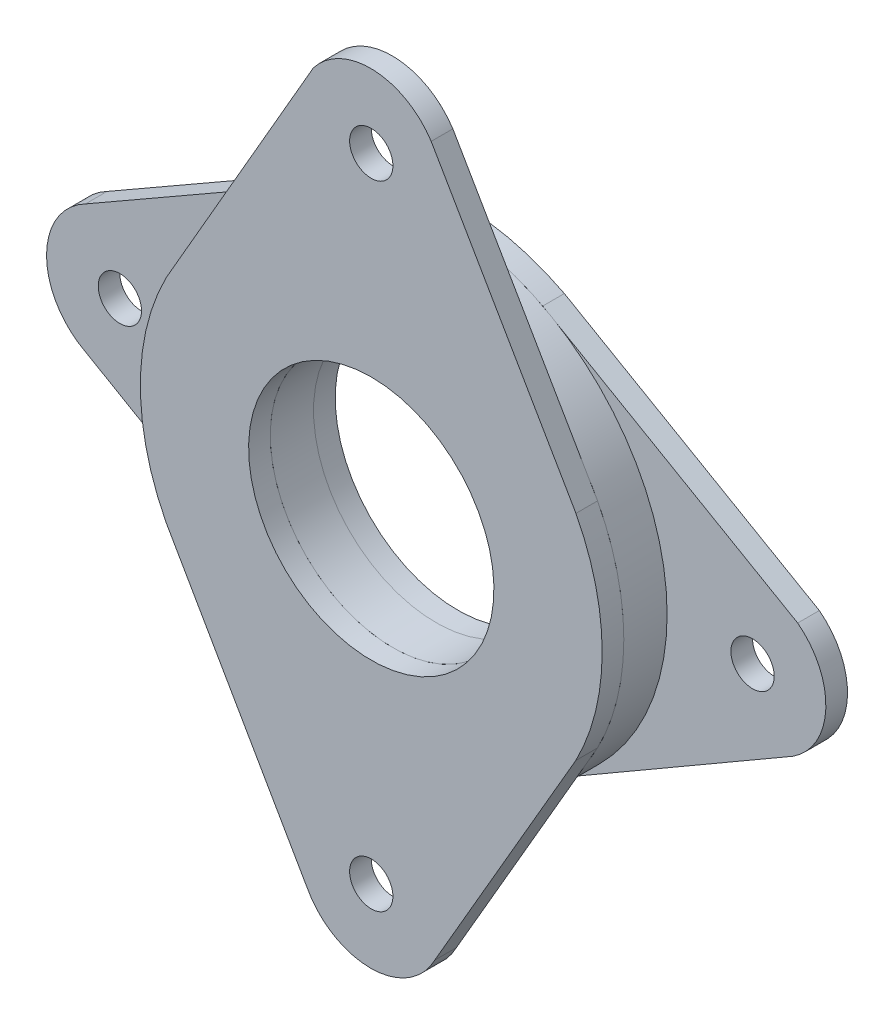
ISO-10303-21;
HEADER;
FILE_DESCRIPTION(('STEP AP214'),'2;1');
FILE_NAME('part.step','',(''),(''),'','','');
FILE_SCHEMA(('AUTOMOTIVE_DESIGN { 1 0 10303 214 1 1 1 1 }'));
ENDSEC;
DATA;
#1=APPLICATION_CONTEXT('core data for automotive mechanical design processes');
#2=APPLICATION_PROTOCOL_DEFINITION('international standard','automotive_design',2000,#1);
#3=PRODUCT_CONTEXT('',#1,'mechanical');
#4=PRODUCT('Part','Part','',(#3));
#5=PRODUCT_RELATED_PRODUCT_CATEGORY('part','',(#4));
#6=PRODUCT_DEFINITION_FORMATION('','',#4);
#7=PRODUCT_DEFINITION_CONTEXT('part definition',#1,'design');
#8=PRODUCT_DEFINITION('design','',#6,#7);
#9=PRODUCT_DEFINITION_SHAPE('','',#8);
#10=(LENGTH_UNIT() NAMED_UNIT(*) SI_UNIT(.MILLI.,.METRE.));
#11=(NAMED_UNIT(*) PLANE_ANGLE_UNIT() SI_UNIT($,.RADIAN.));
#12=(NAMED_UNIT(*) SI_UNIT($,.STERADIAN.) SOLID_ANGLE_UNIT());
#13=UNCERTAINTY_MEASURE_WITH_UNIT(LENGTH_MEASURE(1.E-05),#10,'distance_accuracy_value','');
#14=(GEOMETRIC_REPRESENTATION_CONTEXT(3) GLOBAL_UNCERTAINTY_ASSIGNED_CONTEXT((#13)) GLOBAL_UNIT_ASSIGNED_CONTEXT((#10,
#11,#12)) REPRESENTATION_CONTEXT('',''));
#15=CARTESIAN_POINT('',(0.,0.,0.));
#16=DIRECTION('',(0.,0.,1.));
#17=DIRECTION('',(1.,0.,0.));
#18=AXIS2_PLACEMENT_3D('',#15,#16,#17);
#19=CARTESIAN_POINT('',(0.,0.,1.5));
#20=DIRECTION('',(0.,0.,1.));
#21=DIRECTION('',(1.,0.,0.));
#22=AXIS2_PLACEMENT_3D('',#19,#20,#21);
#23=CYLINDRICAL_SURFACE('',#22,16.);
#24=CARTESIAN_POINT('',(0.,0.,1.5));
#25=DIRECTION('',(0.,0.,1.));
#26=DIRECTION('',(1.,0.,0.));
#27=AXIS2_PLACEMENT_3D('',#24,#25,#26);
#28=CIRCLE('',#27,16.);
#29=CARTESIAN_POINT('',(16.,0.,1.5));
#30=VERTEX_POINT('',#29);
#31=EDGE_CURVE('E11',#30,#30,#28,.T.);
#32=ORIENTED_EDGE('',*,*,#31,.T.);
#33=EDGE_LOOP('',(#32));
#34=FACE_BOUND('',#33,.T.);
#35=CARTESIAN_POINT('',(0.,0.,4.5));
#36=DIRECTION('',(0.,0.,1.));
#37=DIRECTION('',(1.,0.,0.));
#38=AXIS2_PLACEMENT_3D('',#35,#36,#37);
#39=CIRCLE('',#38,16.);
#40=CARTESIAN_POINT('',(16.,0.,4.5));
#41=VERTEX_POINT('',#40);
#42=EDGE_CURVE('E60',#41,#41,#39,.T.);
#43=ORIENTED_EDGE('',*,*,#42,.F.);
#44=EDGE_LOOP('',(#43));
#45=FACE_BOUND('',#44,.T.);
#46=ADVANCED_FACE('F50',(#34,#45),#23,.T.);
#47=CARTESIAN_POINT('',(0.,0.,1.5));
#48=DIRECTION('',(0.,0.,1.));
#49=DIRECTION('',(1.,0.,0.));
#50=AXIS2_PLACEMENT_3D('',#47,#48,#49);
#51=PLANE('',#50);
#52=CARTESIAN_POINT('',(0.,0.,1.5));
#53=DIRECTION('',(0.,0.,1.));
#54=DIRECTION('',(1.,0.,0.));
#55=AXIS2_PLACEMENT_3D('',#52,#53,#54);
#56=CIRCLE('',#55,8.5);
#57=CARTESIAN_POINT('',(8.5,0.,1.5));
#58=VERTEX_POINT('',#57);
#59=EDGE_CURVE('E56',#58,#58,#56,.T.);
#60=ORIENTED_EDGE('',*,*,#59,.T.);
#61=EDGE_LOOP('',(#60));
#62=FACE_BOUND('',#61,.T.);
#63=ORIENTED_EDGE('',*,*,#31,.F.);
#64=EDGE_LOOP('',(#63));
#65=FACE_BOUND('',#64,.T.);
#66=ADVANCED_FACE('F79',(#62,#65),#51,.F.);
#67=CARTESIAN_POINT('',(0.,0.,1.5));
#68=DIRECTION('',(0.,0.,1.));
#69=DIRECTION('',(1.,0.,0.));
#70=AXIS2_PLACEMENT_3D('',#67,#68,#69);
#71=CYLINDRICAL_SURFACE('',#70,8.5);
#72=ORIENTED_EDGE('',*,*,#59,.F.);
#73=EDGE_LOOP('',(#72));
#74=FACE_BOUND('',#73,.T.);
#75=CARTESIAN_POINT('',(0.,0.,4.5));
#76=DIRECTION('',(0.,0.,1.));
#77=DIRECTION('',(1.,0.,0.));
#78=AXIS2_PLACEMENT_3D('',#75,#76,#77);
#79=CIRCLE('',#78,8.5);
#80=CARTESIAN_POINT('',(8.5,0.,4.5));
#81=VERTEX_POINT('',#80);
#82=EDGE_CURVE('E64',#81,#81,#79,.T.);
#83=ORIENTED_EDGE('',*,*,#82,.T.);
#84=EDGE_LOOP('',(#83));
#85=FACE_BOUND('',#84,.T.);
#86=ADVANCED_FACE('F70',(#74,#85),#71,.F.);
#87=CARTESIAN_POINT('',(0.,0.,4.5));
#88=DIRECTION('',(0.,0.,1.));
#89=DIRECTION('',(1.,0.,0.));
#90=AXIS2_PLACEMENT_3D('',#87,#88,#89);
#91=PLANE('',#90);
#92=ORIENTED_EDGE('',*,*,#42,.T.);
#93=EDGE_LOOP('',(#92));
#94=FACE_BOUND('',#93,.T.);
#95=ORIENTED_EDGE('',*,*,#82,.F.);
#96=EDGE_LOOP('',(#95));
#97=FACE_BOUND('',#96,.T.);
#98=ADVANCED_FACE('F72',(#94,#97),#91,.T.);
#99=CLOSED_SHELL('',(#46,#66,#86,#98));
#100=MANIFOLD_SOLID_BREP('B2',#99);
#101=CARTESIAN_POINT('',(0.,0.,4.5));
#102=DIRECTION('',(0.,0.,1.));
#103=DIRECTION('',(0.,-1.,0.));
#104=AXIS2_PLACEMENT_3D('',#101,#102,#103);
#105=CYLINDRICAL_SURFACE('',#104,16.);
#106=CARTESIAN_POINT('',(0.,0.,6.));
#107=DIRECTION('',(0.,0.,1.));
#108=DIRECTION('',(0.,1.,0.));
#109=AXIS2_PLACEMENT_3D('',#106,#107,#108);
#110=CIRCLE('',#109,16.);
#111=CARTESIAN_POINT('',(-14.1966447321718,7.37938197605322,6.));
#112=VERTEX_POINT('',#111);
#113=CARTESIAN_POINT('',(-14.2247700532383,-7.32501992710561,6.));
#114=VERTEX_POINT('',#113);
#115=EDGE_CURVE('E218',#112,#114,#110,.T.);
#116=ORIENTED_EDGE('',*,*,#115,.F.);
#117=DIRECTION('',(0.,0.,1.));
#118=VECTOR('',#117,1.);
#119=CARTESIAN_POINT('',(-14.1966447321718,7.37938197605322,4.5));
#120=LINE('',#119,#118);
#121=CARTESIAN_POINT('',(-14.1966447321718,7.37938197605322,4.5));
#122=VERTEX_POINT('',#121);
#123=EDGE_CURVE('E217',#122,#112,#120,.T.);
#124=ORIENTED_EDGE('',*,*,#123,.F.);
#125=CARTESIAN_POINT('',(0.,0.,4.5));
#126=DIRECTION('',(0.,0.,1.));
#127=DIRECTION('',(0.,1.,0.));
#128=AXIS2_PLACEMENT_3D('',#125,#126,#127);
#129=CIRCLE('',#128,16.);
#130=CARTESIAN_POINT('',(-14.2247700532383,-7.32501992710561,4.5));
#131=VERTEX_POINT('',#130);
#132=EDGE_CURVE('E237',#122,#131,#129,.T.);
#133=ORIENTED_EDGE('',*,*,#132,.T.);
#134=DIRECTION('',(0.,0.,1.));
#135=VECTOR('',#134,1.);
#136=CARTESIAN_POINT('',(-14.2247700532383,-7.32501992710561,4.5));
#137=LINE('',#136,#135);
#138=EDGE_CURVE('E48',#131,#114,#137,.T.);
#139=ORIENTED_EDGE('',*,*,#138,.T.);
#140=EDGE_LOOP('',(#116,#124,#133,#139));
#141=FACE_BOUND('',#140,.T.);
#142=ADVANCED_FACE('F122',(#141),#105,.T.);
#143=CARTESIAN_POINT('',(-4.479321595876,-24.3098461907375,4.5));
#144=DIRECTION('',(0.867365526638176,0.497671621854892,0.));
#145=DIRECTION('',(-0.497671621854892,0.867365526638176,0.));
#146=AXIS2_PLACEMENT_3D('',#143,#144,#145);
#147=PLANE('',#146);
#148=DIRECTION('',(0.497671621854892,-0.867365526638176,0.));
#149=VECTOR('',#148,1.);
#150=CARTESIAN_POINT('',(-4.479321595876,-24.3098461907375,6.));
#151=LINE('',#150,#149);
#152=CARTESIAN_POINT('',(-4.479321595876,-24.3098461907375,6.));
#153=VERTEX_POINT('',#152);
#154=EDGE_CURVE('E220',#114,#153,#151,.T.);
#155=ORIENTED_EDGE('',*,*,#154,.F.);
#156=ORIENTED_EDGE('',*,*,#138,.F.);
#157=DIRECTION('',(0.497671621854892,-0.867365526638176,0.));
#158=VECTOR('',#157,1.);
#159=CARTESIAN_POINT('',(-4.479321595876,-24.3098461907375,4.5));
#160=LINE('',#159,#158);
#161=CARTESIAN_POINT('',(-4.479321595876,-24.3098461907375,4.5));
#162=VERTEX_POINT('',#161);
#163=EDGE_CURVE('E176',#131,#162,#160,.T.);
#164=ORIENTED_EDGE('',*,*,#163,.T.);
#165=DIRECTION('',(0.,0.,1.));
#166=VECTOR('',#165,1.);
#167=CARTESIAN_POINT('',(-4.479321595876,-24.3098461907375,4.5));
#168=LINE('',#167,#166);
#169=EDGE_CURVE('E130',#162,#153,#168,.T.);
#170=ORIENTED_EDGE('',*,*,#169,.T.);
#171=EDGE_LOOP('',(#155,#156,#164,#170));
#172=FACE_BOUND('',#171,.T.);
#173=ADVANCED_FACE('F249',(#172),#147,.F.);
#174=CARTESIAN_POINT('',(-0.0448656845738966,-21.9999542515512,4.5));
#175=DIRECTION('',(0.,0.,1.));
#176=DIRECTION('',(0.,-1.,0.));
#177=AXIS2_PLACEMENT_3D('',#174,#175,#176);
#178=CYLINDRICAL_SURFACE('',#177,5.);
#179=CARTESIAN_POINT('',(-0.0448656845738966,-21.9999542515512,6.));
#180=DIRECTION('',(0.,0.,1.));
#181=DIRECTION('',(0.,1.,0.));
#182=AXIS2_PLACEMENT_3D('',#179,#180,#181);
#183=CIRCLE('',#182,5.);
#184=CARTESIAN_POINT('',(4.39320110895157,-24.3029008719067,6.));
#185=VERTEX_POINT('',#184);
#186=EDGE_CURVE('E224',#153,#185,#183,.T.);
#187=ORIENTED_EDGE('',*,*,#186,.F.);
#188=ORIENTED_EDGE('',*,*,#169,.F.);
#189=CARTESIAN_POINT('',(-0.0448656845738966,-21.9999542515512,4.5));
#190=DIRECTION('',(0.,0.,1.));
#191=DIRECTION('',(0.,1.,0.));
#192=AXIS2_PLACEMENT_3D('',#189,#190,#191);
#193=CIRCLE('',#192,5.);
#194=CARTESIAN_POINT('',(4.39320110895157,-24.3029008719067,4.5));
#195=VERTEX_POINT('',#194);
#196=EDGE_CURVE('E258',#162,#195,#193,.T.);
#197=ORIENTED_EDGE('',*,*,#196,.T.);
#198=DIRECTION('',(0.,0.,1.));
#199=VECTOR('',#198,1.);
#200=CARTESIAN_POINT('',(4.39320110895157,-24.3029008719067,4.5));
#201=LINE('',#200,#199);
#202=EDGE_CURVE('E244',#195,#185,#201,.T.);
#203=ORIENTED_EDGE('',*,*,#202,.T.);
#204=EDGE_LOOP('',(#187,#188,#197,#203));
#205=FACE_BOUND('',#204,.T.);
#206=ADVANCED_FACE('F271',(#205),#178,.T.);
#207=CARTESIAN_POINT('',(4.39320110895158,-24.3029008719067,4.5));
#208=DIRECTION('',(-0.86524131954194,0.501355621248353,0.));
#209=DIRECTION('',(-0.501355621248353,-0.86524131954194,0.));
#210=AXIS2_PLACEMENT_3D('',#207,#208,#209);
#211=PLANE('',#210);
#212=DIRECTION('',(0.501355621248353,0.86524131954194,0.));
#213=VECTOR('',#212,1.);
#214=CARTESIAN_POINT('',(4.39320110895158,-24.3029008719067,6.));
#215=LINE('',#214,#213);
#216=CARTESIAN_POINT('',(14.1719290272993,-7.4267373486069,6.));
#217=VERTEX_POINT('',#216);
#218=EDGE_CURVE('E227',#185,#217,#215,.T.);
#219=ORIENTED_EDGE('',*,*,#218,.F.);
#220=ORIENTED_EDGE('',*,*,#202,.F.);
#221=DIRECTION('',(0.501355621248353,0.86524131954194,0.));
#222=VECTOR('',#221,1.);
#223=CARTESIAN_POINT('',(4.39320110895158,-24.3029008719067,4.5));
#224=LINE('',#223,#222);
#225=CARTESIAN_POINT('',(14.1719290272993,-7.4267373486069,4.5));
#226=VERTEX_POINT('',#225);
#227=EDGE_CURVE('E212',#195,#226,#224,.T.);
#228=ORIENTED_EDGE('',*,*,#227,.T.);
#229=DIRECTION('',(0.,0.,1.));
#230=VECTOR('',#229,1.);
#231=CARTESIAN_POINT('',(14.1719290272993,-7.4267373486069,4.5));
#232=LINE('',#231,#230);
#233=EDGE_CURVE('E241',#226,#217,#232,.T.);
#234=ORIENTED_EDGE('',*,*,#233,.T.);
#235=EDGE_LOOP('',(#219,#220,#228,#234));
#236=FACE_BOUND('',#235,.T.);
#237=ADVANCED_FACE('F267',(#236),#211,.F.);
#238=CARTESIAN_POINT('',(0.,0.,4.5));
#239=DIRECTION('',(0.,0.,1.));
#240=DIRECTION('',(0.,-1.,0.));
#241=AXIS2_PLACEMENT_3D('',#238,#239,#240);
#242=CYLINDRICAL_SURFACE('',#241,16.);
#243=CARTESIAN_POINT('',(0.,0.,6.));
#244=DIRECTION('',(0.,0.,1.));
#245=DIRECTION('',(0.,1.,0.));
#246=AXIS2_PLACEMENT_3D('',#243,#244,#245);
#247=CIRCLE('',#246,16.);
#248=CARTESIAN_POINT('',(14.1817399706489,7.40798565096466,6.));
#249=VERTEX_POINT('',#248);
#250=EDGE_CURVE('E230',#217,#249,#247,.T.);
#251=ORIENTED_EDGE('',*,*,#250,.F.);
#252=ORIENTED_EDGE('',*,*,#233,.F.);
#253=CARTESIAN_POINT('',(0.,0.,4.5));
#254=DIRECTION('',(0.,0.,1.));
#255=DIRECTION('',(0.,1.,0.));
#256=AXIS2_PLACEMENT_3D('',#253,#254,#255);
#257=CIRCLE('',#256,16.);
#258=CARTESIAN_POINT('',(14.1817399706489,7.40798565096466,4.5));
#259=VERTEX_POINT('',#258);
#260=EDGE_CURVE('E210',#226,#259,#257,.T.);
#261=ORIENTED_EDGE('',*,*,#260,.T.);
#262=DIRECTION('',(0.,0.,1.));
#263=VECTOR('',#262,1.);
#264=CARTESIAN_POINT('',(14.1817399706489,7.40798565096466,4.5));
#265=LINE('',#264,#263);
#266=EDGE_CURVE('E204',#259,#249,#265,.T.);
#267=ORIENTED_EDGE('',*,*,#266,.T.);
#268=EDGE_LOOP('',(#251,#252,#261,#267));
#269=FACE_BOUND('',#268,.T.);
#270=ADVANCED_FACE('F270',(#269),#242,.T.);
#271=CARTESIAN_POINT('',(14.1817399706489,7.40798565096467,4.5));
#272=DIRECTION('',(-0.865247361344809,-0.501345194138575,0.));
#273=DIRECTION('',(0.501345194138575,-0.865247361344809,0.));
#274=AXIS2_PLACEMENT_3D('',#271,#272,#273);
#275=PLANE('',#274);
#276=DIRECTION('',(-0.501345194138575,0.865247361344809,0.));
#277=VECTOR('',#276,1.);
#278=CARTESIAN_POINT('',(14.1817399706489,7.40798565096467,6.));
#279=LINE('',#278,#277);
#280=CARTESIAN_POINT('',(4.15252442844814,24.7169224587822,6.));
#281=VERTEX_POINT('',#280);
#282=EDGE_CURVE('E233',#249,#281,#279,.T.);
#283=ORIENTED_EDGE('',*,*,#282,.F.);
#284=ORIENTED_EDGE('',*,*,#266,.F.);
#285=DIRECTION('',(-0.501345194138575,0.865247361344809,0.));
#286=VECTOR('',#285,1.);
#287=CARTESIAN_POINT('',(14.1817399706489,7.40798565096467,4.5));
#288=LINE('',#287,#286);
#289=CARTESIAN_POINT('',(4.15252442844814,24.7169224587822,4.5));
#290=VERTEX_POINT('',#289);
#291=EDGE_CURVE('E194',#259,#290,#288,.T.);
#292=ORIENTED_EDGE('',*,*,#291,.T.);
#293=DIRECTION('',(0.,0.,1.));
#294=VECTOR('',#293,1.);
#295=CARTESIAN_POINT('',(4.15252442844814,24.7169224587822,4.5));
#296=LINE('',#295,#294);
#297=EDGE_CURVE('E199',#290,#281,#296,.T.);
#298=ORIENTED_EDGE('',*,*,#297,.T.);
#299=EDGE_LOOP('',(#283,#284,#292,#298));
#300=FACE_BOUND('',#299,.T.);
#301=ADVANCED_FACE('F207',(#300),#275,.F.);
#302=CARTESIAN_POINT('',(-0.0448656845740502,21.9999542515512,4.5));
#303=DIRECTION('',(0.,0.,1.));
#304=DIRECTION('',(0.,-1.,0.));
#305=AXIS2_PLACEMENT_3D('',#302,#303,#304);
#306=CYLINDRICAL_SURFACE('',#305,5.);
#307=CARTESIAN_POINT('',(-0.0448656845740502,21.9999542515512,6.));
#308=DIRECTION('',(0.,0.,1.));
#309=DIRECTION('',(0.,1.,0.));
#310=AXIS2_PLACEMENT_3D('',#307,#308,#309);
#311=CIRCLE('',#310,5.);
#312=CARTESIAN_POINT('',(-4.00944343188171,25.0466119752795,6.));
#313=VERTEX_POINT('',#312);
#314=EDGE_CURVE('E201',#281,#313,#311,.T.);
#315=ORIENTED_EDGE('',*,*,#314,.F.);
#316=ORIENTED_EDGE('',*,*,#297,.F.);
#317=CARTESIAN_POINT('',(-0.0448656845740502,21.9999542515512,4.5));
#318=DIRECTION('',(0.,0.,1.));
#319=DIRECTION('',(0.,1.,0.));
#320=AXIS2_PLACEMENT_3D('',#317,#318,#319);
#321=CIRCLE('',#320,5.);
#322=CARTESIAN_POINT('',(-4.00944343188171,25.0466119752795,4.5));
#323=VERTEX_POINT('',#322);
#324=EDGE_CURVE('E190',#290,#323,#321,.T.);
#325=ORIENTED_EDGE('',*,*,#324,.T.);
#326=DIRECTION('',(0.,0.,1.));
#327=VECTOR('',#326,1.);
#328=CARTESIAN_POINT('',(-4.00944343188171,25.0466119752795,4.5));
#329=LINE('',#328,#327);
#330=EDGE_CURVE('E205',#323,#313,#329,.T.);
#331=ORIENTED_EDGE('',*,*,#330,.T.);
#332=EDGE_LOOP('',(#315,#316,#325,#331));
#333=FACE_BOUND('',#332,.T.);
#334=ADVANCED_FACE('F200',(#333),#306,.T.);
#335=CARTESIAN_POINT('',(-14.1966447321718,7.37938197605322,4.5));
#336=DIRECTION('',(0.866300842267318,-0.499522622797943,0.));
#337=DIRECTION('',(0.499522622797943,0.866300842267318,0.));
#338=AXIS2_PLACEMENT_3D('',#335,#336,#337);
#339=PLANE('',#338);
#340=DIRECTION('',(-0.499522622797943,-0.866300842267318,0.));
#341=VECTOR('',#340,1.);
#342=CARTESIAN_POINT('',(-14.1966447321718,7.37938197605322,6.));
#343=LINE('',#342,#341);
#344=EDGE_CURVE('E164',#313,#112,#343,.T.);
#345=ORIENTED_EDGE('',*,*,#344,.F.);
#346=ORIENTED_EDGE('',*,*,#330,.F.);
#347=DIRECTION('',(-0.499522622797943,-0.866300842267318,0.));
#348=VECTOR('',#347,1.);
#349=CARTESIAN_POINT('',(-14.1966447321718,7.37938197605322,4.5));
#350=LINE('',#349,#348);
#351=EDGE_CURVE('E138',#323,#122,#350,.T.);
#352=ORIENTED_EDGE('',*,*,#351,.T.);
#353=ORIENTED_EDGE('',*,*,#123,.T.);
#354=EDGE_LOOP('',(#345,#346,#352,#353));
#355=FACE_BOUND('',#354,.T.);
#356=ADVANCED_FACE('F303',(#355),#339,.F.);
#357=CARTESIAN_POINT('',(0.,0.,4.5));
#358=DIRECTION('',(0.,0.,-1.));
#359=DIRECTION('',(0.,1.,0.));
#360=AXIS2_PLACEMENT_3D('',#357,#358,#359);
#361=PLANE('',#360);
#362=CARTESIAN_POINT('',(0.,-21.92,4.5));
#363=DIRECTION('',(0.,0.,1.));
#364=DIRECTION('',(0.,1.,0.));
#365=AXIS2_PLACEMENT_3D('',#362,#363,#364);
#366=CIRCLE('',#365,1.5);
#367=CARTESIAN_POINT('',(0.,-20.42,4.5));
#368=VERTEX_POINT('',#367);
#369=EDGE_CURVE('E364',#368,#368,#366,.T.);
#370=ORIENTED_EDGE('',*,*,#369,.T.);
#371=EDGE_LOOP('',(#370));
#372=FACE_BOUND('',#371,.T.);
#373=CARTESIAN_POINT('',(0.,21.92,4.5));
#374=DIRECTION('',(0.,0.,1.));
#375=DIRECTION('',(0.,1.,0.));
#376=AXIS2_PLACEMENT_3D('',#373,#374,#375);
#377=CIRCLE('',#376,1.5);
#378=CARTESIAN_POINT('',(0.,23.42,4.5));
#379=VERTEX_POINT('',#378);
#380=EDGE_CURVE('E369',#379,#379,#377,.T.);
#381=ORIENTED_EDGE('',*,*,#380,.T.);
#382=EDGE_LOOP('',(#381));
#383=FACE_BOUND('',#382,.T.);
#384=CARTESIAN_POINT('',(0.,0.,4.5));
#385=DIRECTION('',(0.,0.,1.));
#386=DIRECTION('',(0.,1.,0.));
#387=AXIS2_PLACEMENT_3D('',#384,#385,#386);
#388=CIRCLE('',#387,8.5);
#389=CARTESIAN_POINT('',(0.,8.5,4.5));
#390=VERTEX_POINT('',#389);
#391=EDGE_CURVE('E261',#390,#390,#388,.T.);
#392=ORIENTED_EDGE('',*,*,#391,.T.);
#393=EDGE_LOOP('',(#392));
#394=FACE_BOUND('',#393,.T.);
#395=ORIENTED_EDGE('',*,*,#132,.F.);
#396=ORIENTED_EDGE('',*,*,#351,.F.);
#397=ORIENTED_EDGE('',*,*,#324,.F.);
#398=ORIENTED_EDGE('',*,*,#291,.F.);
#399=ORIENTED_EDGE('',*,*,#260,.F.);
#400=ORIENTED_EDGE('',*,*,#227,.F.);
#401=ORIENTED_EDGE('',*,*,#196,.F.);
#402=ORIENTED_EDGE('',*,*,#163,.F.);
#403=EDGE_LOOP('',(#395,#396,#397,#398,#399,#400,#401,#402));
#404=FACE_BOUND('',#403,.T.);
#405=ADVANCED_FACE('F192',(#372,#383,#394,#404),#361,.T.);
#406=CARTESIAN_POINT('',(0.,0.,6.));
#407=DIRECTION('',(0.,0.,-1.));
#408=DIRECTION('',(0.,1.,0.));
#409=AXIS2_PLACEMENT_3D('',#406,#407,#408);
#410=PLANE('',#409);
#411=CARTESIAN_POINT('',(0.,-21.92,6.));
#412=DIRECTION('',(0.,0.,1.));
#413=DIRECTION('',(0.,1.,0.));
#414=AXIS2_PLACEMENT_3D('',#411,#412,#413);
#415=CIRCLE('',#414,1.5);
#416=CARTESIAN_POINT('',(0.,-20.42,6.));
#417=VERTEX_POINT('',#416);
#418=EDGE_CURVE('E221',#417,#417,#415,.T.);
#419=ORIENTED_EDGE('',*,*,#418,.F.);
#420=EDGE_LOOP('',(#419));
#421=FACE_BOUND('',#420,.T.);
#422=CARTESIAN_POINT('',(0.,21.92,6.));
#423=DIRECTION('',(0.,0.,1.));
#424=DIRECTION('',(0.,1.,0.));
#425=AXIS2_PLACEMENT_3D('',#422,#423,#424);
#426=CIRCLE('',#425,1.5);
#427=CARTESIAN_POINT('',(0.,23.42,6.));
#428=VERTEX_POINT('',#427);
#429=EDGE_CURVE('E365',#428,#428,#426,.T.);
#430=ORIENTED_EDGE('',*,*,#429,.F.);
#431=EDGE_LOOP('',(#430));
#432=FACE_BOUND('',#431,.T.);
#433=CARTESIAN_POINT('',(0.,0.,6.));
#434=DIRECTION('',(0.,0.,1.));
#435=DIRECTION('',(0.,1.,0.));
#436=AXIS2_PLACEMENT_3D('',#433,#434,#435);
#437=CIRCLE('',#436,8.5);
#438=CARTESIAN_POINT('',(0.,8.5,6.));
#439=VERTEX_POINT('',#438);
#440=EDGE_CURVE('E373',#439,#439,#437,.T.);
#441=ORIENTED_EDGE('',*,*,#440,.F.);
#442=EDGE_LOOP('',(#441));
#443=FACE_BOUND('',#442,.T.);
#444=ORIENTED_EDGE('',*,*,#115,.T.);
#445=ORIENTED_EDGE('',*,*,#154,.T.);
#446=ORIENTED_EDGE('',*,*,#186,.T.);
#447=ORIENTED_EDGE('',*,*,#218,.T.);
#448=ORIENTED_EDGE('',*,*,#250,.T.);
#449=ORIENTED_EDGE('',*,*,#282,.T.);
#450=ORIENTED_EDGE('',*,*,#314,.T.);
#451=ORIENTED_EDGE('',*,*,#344,.T.);
#452=EDGE_LOOP('',(#444,#445,#446,#447,#448,#449,#450,#451));
#453=FACE_BOUND('',#452,.T.);
#454=ADVANCED_FACE('F252',(#421,#432,#443,#453),#410,.F.);
#455=CARTESIAN_POINT('',(0.,0.,6.));
#456=DIRECTION('',(0.,0.,-1.));
#457=DIRECTION('',(0.,1.,0.));
#458=AXIS2_PLACEMENT_3D('',#455,#456,#457);
#459=CYLINDRICAL_SURFACE('',#458,8.5);
#460=ORIENTED_EDGE('',*,*,#440,.T.);
#461=EDGE_LOOP('',(#460));
#462=FACE_BOUND('',#461,.T.);
#463=ORIENTED_EDGE('',*,*,#391,.F.);
#464=EDGE_LOOP('',(#463));
#465=FACE_BOUND('',#464,.T.);
#466=ADVANCED_FACE('F322',(#462,#465),#459,.F.);
#467=CARTESIAN_POINT('',(0.,21.92,6.));
#468=DIRECTION('',(0.,0.,-1.));
#469=DIRECTION('',(0.,1.,0.));
#470=AXIS2_PLACEMENT_3D('',#467,#468,#469);
#471=CYLINDRICAL_SURFACE('',#470,1.5);
#472=ORIENTED_EDGE('',*,*,#429,.T.);
#473=EDGE_LOOP('',(#472));
#474=FACE_BOUND('',#473,.T.);
#475=ORIENTED_EDGE('',*,*,#380,.F.);
#476=EDGE_LOOP('',(#475));
#477=FACE_BOUND('',#476,.T.);
#478=ADVANCED_FACE('F335',(#474,#477),#471,.F.);
#479=CARTESIAN_POINT('',(0.,-21.92,6.));
#480=DIRECTION('',(0.,0.,-1.));
#481=DIRECTION('',(0.,1.,0.));
#482=AXIS2_PLACEMENT_3D('',#479,#480,#481);
#483=CYLINDRICAL_SURFACE('',#482,1.5);
#484=ORIENTED_EDGE('',*,*,#418,.T.);
#485=EDGE_LOOP('',(#484));
#486=FACE_BOUND('',#485,.T.);
#487=ORIENTED_EDGE('',*,*,#369,.F.);
#488=EDGE_LOOP('',(#487));
#489=FACE_BOUND('',#488,.T.);
#490=ADVANCED_FACE('F345',(#486,#489),#483,.F.);
#491=CLOSED_SHELL('',(#142,#173,#206,#237,#270,#301,#334,#356,#405,#454,#466,#478,#490));
#492=MANIFOLD_SOLID_BREP('B6',#491);
#493=CARTESIAN_POINT('',(0.,0.,1.5));
#494=DIRECTION('',(0.,0.,-1.));
#495=DIRECTION('',(-1.,0.,0.));
#496=AXIS2_PLACEMENT_3D('',#493,#494,#495);
#497=CYLINDRICAL_SURFACE('',#496,16.);
#498=CARTESIAN_POINT('',(0.,0.,0.));
#499=DIRECTION('',(0.,0.,1.));
#500=DIRECTION('',(1.,0.,0.));
#501=AXIS2_PLACEMENT_3D('',#498,#499,#500);
#502=CIRCLE('',#501,16.);
#503=CARTESIAN_POINT('',(7.37938197605327,14.1966447321718,0.));
#504=VERTEX_POINT('',#503);
#505=CARTESIAN_POINT('',(-7.32501992710556,14.2247700532383,0.));
#506=VERTEX_POINT('',#505);
#507=EDGE_CURVE('E528',#504,#506,#502,.T.);
#508=ORIENTED_EDGE('',*,*,#507,.T.);
#509=DIRECTION('',(0.,0.,-1.));
#510=VECTOR('',#509,1.);
#511=CARTESIAN_POINT('',(-7.32501992710556,14.2247700532383,1.5));
#512=LINE('',#511,#510);
#513=CARTESIAN_POINT('',(-7.32501992710556,14.2247700532383,1.5));
#514=VERTEX_POINT('',#513);
#515=EDGE_CURVE('E120',#514,#506,#512,.T.);
#516=ORIENTED_EDGE('',*,*,#515,.F.);
#517=CARTESIAN_POINT('',(0.,0.,1.5));
#518=DIRECTION('',(0.,0.,1.));
#519=DIRECTION('',(1.,0.,0.));
#520=AXIS2_PLACEMENT_3D('',#517,#518,#519);
#521=CIRCLE('',#520,16.);
#522=CARTESIAN_POINT('',(7.37938197605327,14.1966447321718,1.5));
#523=VERTEX_POINT('',#522);
#524=EDGE_CURVE('E543',#523,#514,#521,.T.);
#525=ORIENTED_EDGE('',*,*,#524,.F.);
#526=DIRECTION('',(0.,0.,-1.));
#527=VECTOR('',#526,1.);
#528=CARTESIAN_POINT('',(7.37938197605327,14.1966447321718,1.5));
#529=LINE('',#528,#527);
#530=EDGE_CURVE('E524',#523,#504,#529,.T.);
#531=ORIENTED_EDGE('',*,*,#530,.T.);
#532=EDGE_LOOP('',(#508,#516,#525,#531));
#533=FACE_BOUND('',#532,.T.);
#534=ADVANCED_FACE('F432',(#533),#497,.T.);
#535=CARTESIAN_POINT('',(-24.3098461907375,4.47932159587608,1.5));
#536=DIRECTION('',(0.497671621854889,-0.867365526638178,0.));
#537=DIRECTION('',(0.867365526638178,0.497671621854889,0.));
#538=AXIS2_PLACEMENT_3D('',#535,#536,#537);
#539=PLANE('',#538);
#540=DIRECTION('',(-0.867365526638178,-0.497671621854889,0.));
#541=VECTOR('',#540,1.);
#542=CARTESIAN_POINT('',(-24.3098461907375,4.47932159587608,0.));
#543=LINE('',#542,#541);
#544=CARTESIAN_POINT('',(-24.3098461907375,4.47932159587608,0.));
#545=VERTEX_POINT('',#544);
#546=EDGE_CURVE('E531',#506,#545,#543,.T.);
#547=ORIENTED_EDGE('',*,*,#546,.T.);
#548=DIRECTION('',(0.,0.,-1.));
#549=VECTOR('',#548,1.);
#550=CARTESIAN_POINT('',(-24.3098461907375,4.47932159587608,1.5));
#551=LINE('',#550,#549);
#552=CARTESIAN_POINT('',(-24.3098461907375,4.47932159587608,1.5));
#553=VERTEX_POINT('',#552);
#554=EDGE_CURVE('E440',#553,#545,#551,.T.);
#555=ORIENTED_EDGE('',*,*,#554,.F.);
#556=DIRECTION('',(-0.867365526638178,-0.497671621854889,0.));
#557=VECTOR('',#556,1.);
#558=CARTESIAN_POINT('',(-24.3098461907375,4.47932159587608,1.5));
#559=LINE('',#558,#557);
#560=EDGE_CURVE('E491',#514,#553,#559,.T.);
#561=ORIENTED_EDGE('',*,*,#560,.F.);
#562=ORIENTED_EDGE('',*,*,#515,.T.);
#563=EDGE_LOOP('',(#547,#555,#561,#562));
#564=FACE_BOUND('',#563,.T.);
#565=ADVANCED_FACE('F625',(#564),#539,.F.);
#566=CARTESIAN_POINT('',(-21.9999542515512,0.0448656845739734,1.5));
#567=DIRECTION('',(0.,0.,-1.));
#568=DIRECTION('',(-1.,0.,0.));
#569=AXIS2_PLACEMENT_3D('',#566,#567,#568);
#570=CYLINDRICAL_SURFACE('',#569,5.);
#571=CARTESIAN_POINT('',(-21.9999542515512,0.0448656845739734,0.));
#572=DIRECTION('',(0.,0.,1.));
#573=DIRECTION('',(1.,0.,0.));
#574=AXIS2_PLACEMENT_3D('',#571,#572,#573);
#575=CIRCLE('',#574,5.);
#576=CARTESIAN_POINT('',(-24.3029008719067,-4.39320110895149,0.));
#577=VERTEX_POINT('',#576);
#578=EDGE_CURVE('E534',#545,#577,#575,.T.);
#579=ORIENTED_EDGE('',*,*,#578,.T.);
#580=DIRECTION('',(0.,0.,-1.));
#581=VECTOR('',#580,1.);
#582=CARTESIAN_POINT('',(-24.3029008719067,-4.39320110895149,1.5));
#583=LINE('',#582,#581);
#584=CARTESIAN_POINT('',(-24.3029008719067,-4.39320110895149,1.5));
#585=VERTEX_POINT('',#584);
#586=EDGE_CURVE('E550',#585,#577,#583,.T.);
#587=ORIENTED_EDGE('',*,*,#586,.F.);
#588=CARTESIAN_POINT('',(-21.9999542515512,0.0448656845739734,1.5));
#589=DIRECTION('',(0.,0.,1.));
#590=DIRECTION('',(1.,0.,0.));
#591=AXIS2_PLACEMENT_3D('',#588,#589,#590);
#592=CIRCLE('',#591,5.);
#593=EDGE_CURVE('E558',#553,#585,#592,.T.);
#594=ORIENTED_EDGE('',*,*,#593,.F.);
#595=ORIENTED_EDGE('',*,*,#554,.T.);
#596=EDGE_LOOP('',(#579,#587,#594,#595));
#597=FACE_BOUND('',#596,.T.);
#598=ADVANCED_FACE('F556',(#597),#570,.T.);
#599=CARTESIAN_POINT('',(-24.3029008719067,-4.39320110895149,1.5));
#600=DIRECTION('',(0.501355621248356,0.865241319541938,0.));
#601=DIRECTION('',(-0.865241319541939,0.501355621248356,0.));
#602=AXIS2_PLACEMENT_3D('',#599,#600,#601);
#603=PLANE('',#602);
#604=DIRECTION('',(0.865241319541939,-0.501355621248356,0.));
#605=VECTOR('',#604,1.);
#606=CARTESIAN_POINT('',(-24.3029008719067,-4.39320110895149,0.));
#607=LINE('',#606,#605);
#608=CARTESIAN_POINT('',(-7.42673734860694,-14.1719290272992,0.));
#609=VERTEX_POINT('',#608);
#610=EDGE_CURVE('E536',#577,#609,#607,.T.);
#611=ORIENTED_EDGE('',*,*,#610,.T.);
#612=DIRECTION('',(0.,0.,-1.));
#613=VECTOR('',#612,1.);
#614=CARTESIAN_POINT('',(-7.42673734860694,-14.1719290272992,1.5));
#615=LINE('',#614,#613);
#616=CARTESIAN_POINT('',(-7.42673734860694,-14.1719290272992,1.5));
#617=VERTEX_POINT('',#616);
#618=EDGE_CURVE('E547',#617,#609,#615,.T.);
#619=ORIENTED_EDGE('',*,*,#618,.F.);
#620=DIRECTION('',(0.865241319541939,-0.501355621248356,0.));
#621=VECTOR('',#620,1.);
#622=CARTESIAN_POINT('',(-24.3029008719067,-4.39320110895149,1.5));
#623=LINE('',#622,#621);
#624=EDGE_CURVE('E570',#585,#617,#623,.T.);
#625=ORIENTED_EDGE('',*,*,#624,.F.);
#626=ORIENTED_EDGE('',*,*,#586,.T.);
#627=EDGE_LOOP('',(#611,#619,#625,#626));
#628=FACE_BOUND('',#627,.T.);
#629=ADVANCED_FACE('F566',(#628),#603,.F.);
#630=CARTESIAN_POINT('',(0.,0.,1.5));
#631=DIRECTION('',(0.,0.,-1.));
#632=DIRECTION('',(-1.,0.,0.));
#633=AXIS2_PLACEMENT_3D('',#630,#631,#632);
#634=CYLINDRICAL_SURFACE('',#633,16.);
#635=CARTESIAN_POINT('',(0.,0.,0.));
#636=DIRECTION('',(0.,0.,1.));
#637=DIRECTION('',(1.,0.,0.));
#638=AXIS2_PLACEMENT_3D('',#635,#636,#637);
#639=CIRCLE('',#638,16.);
#640=CARTESIAN_POINT('',(7.40798565096461,-14.181739970649,0.));
#641=VERTEX_POINT('',#640);
#642=EDGE_CURVE('E538',#609,#641,#639,.T.);
#643=ORIENTED_EDGE('',*,*,#642,.T.);
#644=DIRECTION('',(0.,0.,-1.));
#645=VECTOR('',#644,1.);
#646=CARTESIAN_POINT('',(7.40798565096461,-14.181739970649,1.5));
#647=LINE('',#646,#645);
#648=CARTESIAN_POINT('',(7.40798565096461,-14.181739970649,1.5));
#649=VERTEX_POINT('',#648);
#650=EDGE_CURVE('E519',#649,#641,#647,.T.);
#651=ORIENTED_EDGE('',*,*,#650,.F.);
#652=CARTESIAN_POINT('',(0.,0.,1.5));
#653=DIRECTION('',(0.,0.,1.));
#654=DIRECTION('',(1.,0.,0.));
#655=AXIS2_PLACEMENT_3D('',#652,#653,#654);
#656=CIRCLE('',#655,16.);
#657=EDGE_CURVE('E510',#617,#649,#656,.T.);
#658=ORIENTED_EDGE('',*,*,#657,.F.);
#659=ORIENTED_EDGE('',*,*,#618,.T.);
#660=EDGE_LOOP('',(#643,#651,#658,#659));
#661=FACE_BOUND('',#660,.T.);
#662=ADVANCED_FACE('F569',(#661),#634,.T.);
#663=CARTESIAN_POINT('',(7.40798565096462,-14.181739970649,1.5));
#664=DIRECTION('',(-0.501345194138572,0.865247361344811,0.));
#665=DIRECTION('',(-0.865247361344811,-0.501345194138572,0.));
#666=AXIS2_PLACEMENT_3D('',#663,#664,#665);
#667=PLANE('',#666);
#668=DIRECTION('',(0.865247361344811,0.501345194138572,0.));
#669=VECTOR('',#668,1.);
#670=CARTESIAN_POINT('',(7.40798565096462,-14.181739970649,0.));
#671=LINE('',#670,#669);
#672=CARTESIAN_POINT('',(24.7169224587821,-4.15252442844823,0.));
#673=VERTEX_POINT('',#672);
#674=EDGE_CURVE('E518',#641,#673,#671,.T.);
#675=ORIENTED_EDGE('',*,*,#674,.T.);
#676=DIRECTION('',(0.,0.,-1.));
#677=VECTOR('',#676,1.);
#678=CARTESIAN_POINT('',(24.7169224587821,-4.15252442844823,1.5));
#679=LINE('',#678,#677);
#680=CARTESIAN_POINT('',(24.7169224587821,-4.15252442844823,1.5));
#681=VERTEX_POINT('',#680);
#682=EDGE_CURVE('E515',#681,#673,#679,.T.);
#683=ORIENTED_EDGE('',*,*,#682,.F.);
#684=DIRECTION('',(0.865247361344811,0.501345194138572,0.));
#685=VECTOR('',#684,1.);
#686=CARTESIAN_POINT('',(7.40798565096462,-14.181739970649,1.5));
#687=LINE('',#686,#685);
#688=EDGE_CURVE('E504',#649,#681,#687,.T.);
#689=ORIENTED_EDGE('',*,*,#688,.F.);
#690=ORIENTED_EDGE('',*,*,#650,.T.);
#691=EDGE_LOOP('',(#675,#683,#689,#690));
#692=FACE_BOUND('',#691,.T.);
#693=ADVANCED_FACE('F516',(#692),#667,.F.);
#694=CARTESIAN_POINT('',(21.9999542515512,0.0448656845739734,1.5));
#695=DIRECTION('',(0.,0.,-1.));
#696=DIRECTION('',(-1.,0.,0.));
#697=AXIS2_PLACEMENT_3D('',#694,#695,#696);
#698=CYLINDRICAL_SURFACE('',#697,5.);
#699=CARTESIAN_POINT('',(21.9999542515512,0.0448656845739734,0.));
#700=DIRECTION('',(0.,0.,1.));
#701=DIRECTION('',(1.,0.,0.));
#702=AXIS2_PLACEMENT_3D('',#699,#700,#701);
#703=CIRCLE('',#702,5.);
#704=CARTESIAN_POINT('',(25.0466119752795,4.00944343188162,0.));
#705=VERTEX_POINT('',#704);
#706=EDGE_CURVE('E477',#673,#705,#703,.T.);
#707=ORIENTED_EDGE('',*,*,#706,.T.);
#708=DIRECTION('',(0.,0.,-1.));
#709=VECTOR('',#708,1.);
#710=CARTESIAN_POINT('',(25.0466119752795,4.00944343188162,1.5));
#711=LINE('',#710,#709);
#712=CARTESIAN_POINT('',(25.0466119752795,4.00944343188162,1.5));
#713=VERTEX_POINT('',#712);
#714=EDGE_CURVE('E520',#713,#705,#711,.T.);
#715=ORIENTED_EDGE('',*,*,#714,.F.);
#716=CARTESIAN_POINT('',(21.9999542515512,0.0448656845739734,1.5));
#717=DIRECTION('',(0.,0.,1.));
#718=DIRECTION('',(1.,0.,0.));
#719=AXIS2_PLACEMENT_3D('',#716,#717,#718);
#720=CIRCLE('',#719,5.);
#721=EDGE_CURVE('E508',#681,#713,#720,.T.);
#722=ORIENTED_EDGE('',*,*,#721,.F.);
#723=ORIENTED_EDGE('',*,*,#682,.T.);
#724=EDGE_LOOP('',(#707,#715,#722,#723));
#725=FACE_BOUND('',#724,.T.);
#726=ADVANCED_FACE('F522',(#725),#698,.T.);
#727=CARTESIAN_POINT('',(7.37938197605327,14.1966447321718,1.5));
#728=DIRECTION('',(-0.499522622797946,-0.866300842267316,0.));
#729=DIRECTION('',(0.866300842267316,-0.499522622797946,0.));
#730=AXIS2_PLACEMENT_3D('',#727,#728,#729);
#731=PLANE('',#730);
#732=DIRECTION('',(-0.866300842267316,0.499522622797946,0.));
#733=VECTOR('',#732,1.);
#734=CARTESIAN_POINT('',(7.37938197605327,14.1966447321718,0.));
#735=LINE('',#734,#733);
#736=EDGE_CURVE('E483',#705,#504,#735,.T.);
#737=ORIENTED_EDGE('',*,*,#736,.T.);
#738=ORIENTED_EDGE('',*,*,#530,.F.);
#739=DIRECTION('',(-0.866300842267316,0.499522622797946,0.));
#740=VECTOR('',#739,1.);
#741=CARTESIAN_POINT('',(7.37938197605327,14.1966447321718,1.5));
#742=LINE('',#741,#740);
#743=EDGE_CURVE('E448',#713,#523,#742,.T.);
#744=ORIENTED_EDGE('',*,*,#743,.F.);
#745=ORIENTED_EDGE('',*,*,#714,.T.);
#746=EDGE_LOOP('',(#737,#738,#744,#745));
#747=FACE_BOUND('',#746,.T.);
#748=ADVANCED_FACE('F605',(#747),#731,.F.);
#749=CARTESIAN_POINT('',(0.,0.,1.5));
#750=DIRECTION('',(0.,0.,1.));
#751=DIRECTION('',(1.,0.,0.));
#752=AXIS2_PLACEMENT_3D('',#749,#750,#751);
#753=PLANE('',#752);
#754=CARTESIAN_POINT('',(-21.92,0.,1.5));
#755=DIRECTION('',(0.,0.,1.));
#756=DIRECTION('',(1.,0.,0.));
#757=AXIS2_PLACEMENT_3D('',#754,#755,#756);
#758=CIRCLE('',#757,1.5);
#759=CARTESIAN_POINT('',(-20.42,0.,1.5));
#760=VERTEX_POINT('',#759);
#761=EDGE_CURVE('E588',#760,#760,#758,.T.);
#762=ORIENTED_EDGE('',*,*,#761,.F.);
#763=EDGE_LOOP('',(#762));
#764=FACE_BOUND('',#763,.T.);
#765=CARTESIAN_POINT('',(21.92,0.,1.5));
#766=DIRECTION('',(0.,0.,1.));
#767=DIRECTION('',(1.,0.,0.));
#768=AXIS2_PLACEMENT_3D('',#765,#766,#767);
#769=CIRCLE('',#768,1.5);
#770=CARTESIAN_POINT('',(23.42,0.,1.5));
#771=VERTEX_POINT('',#770);
#772=EDGE_CURVE('E582',#771,#771,#769,.T.);
#773=ORIENTED_EDGE('',*,*,#772,.F.);
#774=EDGE_LOOP('',(#773));
#775=FACE_BOUND('',#774,.T.);
#776=CARTESIAN_POINT('',(0.,0.,1.5));
#777=DIRECTION('',(0.,0.,1.));
#778=DIRECTION('',(1.,0.,0.));
#779=AXIS2_PLACEMENT_3D('',#776,#777,#778);
#780=CIRCLE('',#779,8.5);
#781=CARTESIAN_POINT('',(8.5,0.,1.5));
#782=VERTEX_POINT('',#781);
#783=EDGE_CURVE('E576',#782,#782,#780,.T.);
#784=ORIENTED_EDGE('',*,*,#783,.F.);
#785=EDGE_LOOP('',(#784));
#786=FACE_BOUND('',#785,.T.);
#787=ORIENTED_EDGE('',*,*,#524,.T.);
#788=ORIENTED_EDGE('',*,*,#560,.T.);
#789=ORIENTED_EDGE('',*,*,#593,.T.);
#790=ORIENTED_EDGE('',*,*,#624,.T.);
#791=ORIENTED_EDGE('',*,*,#657,.T.);
#792=ORIENTED_EDGE('',*,*,#688,.T.);
#793=ORIENTED_EDGE('',*,*,#721,.T.);
#794=ORIENTED_EDGE('',*,*,#743,.T.);
#795=EDGE_LOOP('',(#787,#788,#789,#790,#791,#792,#793,#794));
#796=FACE_BOUND('',#795,.T.);
#797=ADVANCED_FACE('F506',(#764,#775,#786,#796),#753,.T.);
#798=CARTESIAN_POINT('',(0.,0.,0.));
#799=DIRECTION('',(0.,0.,1.));
#800=DIRECTION('',(1.,0.,0.));
#801=AXIS2_PLACEMENT_3D('',#798,#799,#800);
#802=PLANE('',#801);
#803=CARTESIAN_POINT('',(-21.92,0.,0.));
#804=DIRECTION('',(0.,0.,1.));
#805=DIRECTION('',(1.,0.,0.));
#806=AXIS2_PLACEMENT_3D('',#803,#804,#805);
#807=CIRCLE('',#806,1.5);
#808=CARTESIAN_POINT('',(-20.42,0.,0.));
#809=VERTEX_POINT('',#808);
#810=EDGE_CURVE('E532',#809,#809,#807,.T.);
#811=ORIENTED_EDGE('',*,*,#810,.T.);
#812=EDGE_LOOP('',(#811));
#813=FACE_BOUND('',#812,.T.);
#814=CARTESIAN_POINT('',(21.92,0.,0.));
#815=DIRECTION('',(0.,0.,1.));
#816=DIRECTION('',(1.,0.,0.));
#817=AXIS2_PLACEMENT_3D('',#814,#815,#816);
#818=CIRCLE('',#817,1.5);
#819=CARTESIAN_POINT('',(23.42,0.,0.));
#820=VERTEX_POINT('',#819);
#821=EDGE_CURVE('E585',#820,#820,#818,.T.);
#822=ORIENTED_EDGE('',*,*,#821,.T.);
#823=EDGE_LOOP('',(#822));
#824=FACE_BOUND('',#823,.T.);
#825=CARTESIAN_POINT('',(0.,0.,0.));
#826=DIRECTION('',(0.,0.,1.));
#827=DIRECTION('',(1.,0.,0.));
#828=AXIS2_PLACEMENT_3D('',#825,#826,#827);
#829=CIRCLE('',#828,8.5);
#830=CARTESIAN_POINT('',(8.5,0.,0.));
#831=VERTEX_POINT('',#830);
#832=EDGE_CURVE('E579',#831,#831,#829,.T.);
#833=ORIENTED_EDGE('',*,*,#832,.T.);
#834=EDGE_LOOP('',(#833));
#835=FACE_BOUND('',#834,.T.);
#836=ORIENTED_EDGE('',*,*,#507,.F.);
#837=ORIENTED_EDGE('',*,*,#736,.F.);
#838=ORIENTED_EDGE('',*,*,#706,.F.);
#839=ORIENTED_EDGE('',*,*,#674,.F.);
#840=ORIENTED_EDGE('',*,*,#642,.F.);
#841=ORIENTED_EDGE('',*,*,#610,.F.);
#842=ORIENTED_EDGE('',*,*,#578,.F.);
#843=ORIENTED_EDGE('',*,*,#546,.F.);
#844=EDGE_LOOP('',(#836,#837,#838,#839,#840,#841,#842,#843));
#845=FACE_BOUND('',#844,.T.);
#846=ADVANCED_FACE('F562',(#813,#824,#835,#845),#802,.F.);
#847=CARTESIAN_POINT('',(0.,0.,0.));
#848=DIRECTION('',(0.,0.,1.));
#849=DIRECTION('',(1.,0.,0.));
#850=AXIS2_PLACEMENT_3D('',#847,#848,#849);
#851=CYLINDRICAL_SURFACE('',#850,8.5);
#852=ORIENTED_EDGE('',*,*,#832,.F.);
#853=EDGE_LOOP('',(#852));
#854=FACE_BOUND('',#853,.T.);
#855=ORIENTED_EDGE('',*,*,#783,.T.);
#856=EDGE_LOOP('',(#855));
#857=FACE_BOUND('',#856,.T.);
#858=ADVANCED_FACE('F611',(#854,#857),#851,.F.);
#859=CARTESIAN_POINT('',(21.92,0.,0.));
#860=DIRECTION('',(0.,0.,1.));
#861=DIRECTION('',(1.,0.,0.));
#862=AXIS2_PLACEMENT_3D('',#859,#860,#861);
#863=CYLINDRICAL_SURFACE('',#862,1.5);
#864=ORIENTED_EDGE('',*,*,#821,.F.);
#865=EDGE_LOOP('',(#864));
#866=FACE_BOUND('',#865,.T.);
#867=ORIENTED_EDGE('',*,*,#772,.T.);
#868=EDGE_LOOP('',(#867));
#869=FACE_BOUND('',#868,.T.);
#870=ADVANCED_FACE('F599',(#866,#869),#863,.F.);
#871=CARTESIAN_POINT('',(-21.92,0.,0.));
#872=DIRECTION('',(0.,0.,1.));
#873=DIRECTION('',(1.,0.,0.));
#874=AXIS2_PLACEMENT_3D('',#871,#872,#873);
#875=CYLINDRICAL_SURFACE('',#874,1.5);
#876=ORIENTED_EDGE('',*,*,#810,.F.);
#877=EDGE_LOOP('',(#876));
#878=FACE_BOUND('',#877,.T.);
#879=ORIENTED_EDGE('',*,*,#761,.T.);
#880=EDGE_LOOP('',(#879));
#881=FACE_BOUND('',#880,.T.);
#882=ADVANCED_FACE('F596',(#878,#881),#875,.F.);
#883=CLOSED_SHELL('',(#534,#565,#598,#629,#662,#693,#726,#748,#797,#846,#858,#870,#882));
#884=MANIFOLD_SOLID_BREP('B42',#883);
#885=ADVANCED_BREP_SHAPE_REPRESENTATION('',(#18,#100,#492,#884),#14);
#886=SHAPE_DEFINITION_REPRESENTATION(#9,#885);
ENDSEC;
END-ISO-10303-21;
